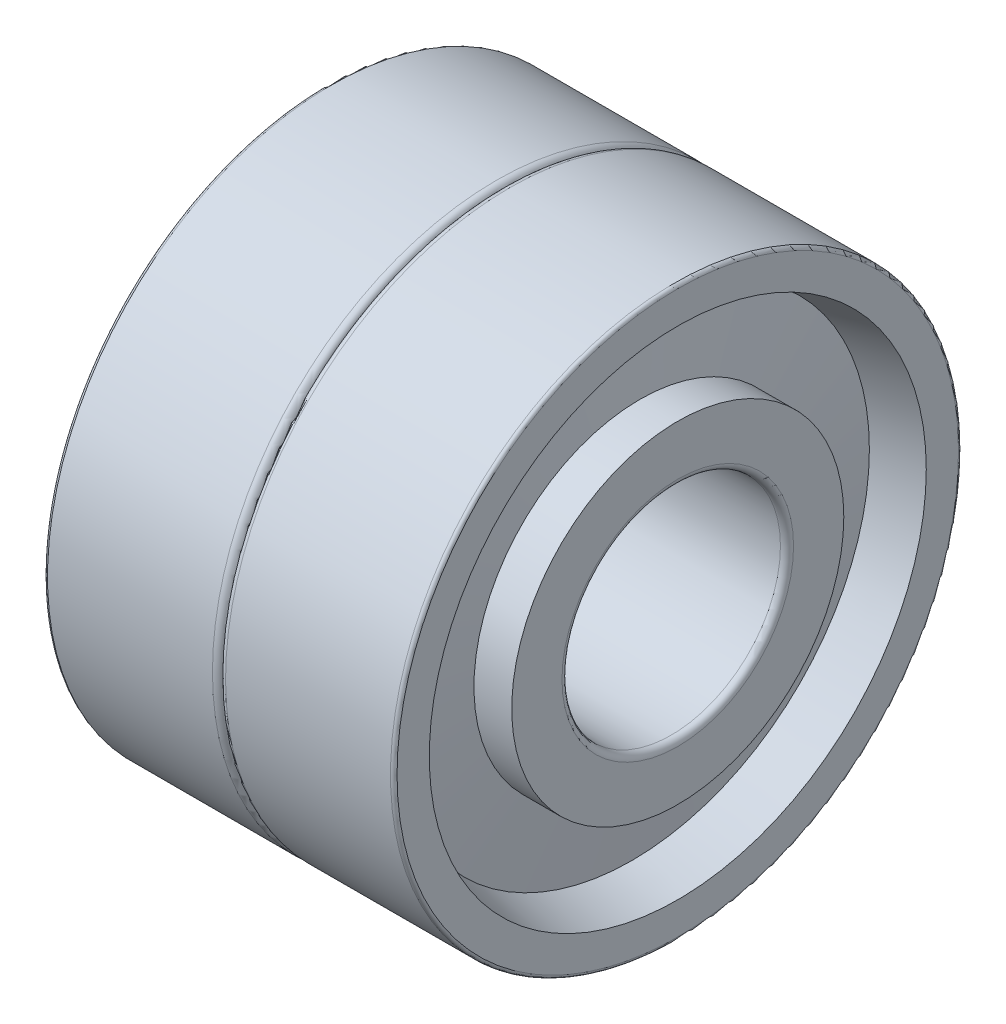
ISO-10303-21;
HEADER;
FILE_DESCRIPTION(('STEP AP214'),'2;1');
FILE_NAME('part.step','',(''),(''),'','','');
FILE_SCHEMA(('AUTOMOTIVE_DESIGN { 1 0 10303 214 1 1 1 1 }'));
ENDSEC;
DATA;
#1=APPLICATION_CONTEXT('core data for automotive mechanical design processes');
#2=APPLICATION_PROTOCOL_DEFINITION('international standard','automotive_design',2000,#1);
#3=PRODUCT_CONTEXT('',#1,'mechanical');
#4=PRODUCT('Part','Part','',(#3));
#5=PRODUCT_RELATED_PRODUCT_CATEGORY('part','',(#4));
#6=PRODUCT_DEFINITION_FORMATION('','',#4);
#7=PRODUCT_DEFINITION_CONTEXT('part definition',#1,'design');
#8=PRODUCT_DEFINITION('design','',#6,#7);
#9=PRODUCT_DEFINITION_SHAPE('','',#8);
#10=(LENGTH_UNIT() NAMED_UNIT(*) SI_UNIT(.MILLI.,.METRE.));
#11=(NAMED_UNIT(*) PLANE_ANGLE_UNIT() SI_UNIT($,.RADIAN.));
#12=(NAMED_UNIT(*) SI_UNIT($,.STERADIAN.) SOLID_ANGLE_UNIT());
#13=UNCERTAINTY_MEASURE_WITH_UNIT(LENGTH_MEASURE(1.E-05),#10,'distance_accuracy_value','');
#14=(GEOMETRIC_REPRESENTATION_CONTEXT(3) GLOBAL_UNCERTAINTY_ASSIGNED_CONTEXT((#13)) GLOBAL_UNIT_ASSIGNED_CONTEXT((#10,
#11,#12)) REPRESENTATION_CONTEXT('',''));
#15=CARTESIAN_POINT('',(0.,0.,0.));
#16=DIRECTION('',(0.,0.,1.));
#17=DIRECTION('',(1.,0.,0.));
#18=AXIS2_PLACEMENT_3D('',#15,#16,#17);
#19=CARTESIAN_POINT('',(3.925,0.,0.));
#20=DIRECTION('',(1.,0.,0.));
#21=DIRECTION('',(0.,0.,-1.));
#22=AXIS2_PLACEMENT_3D('',#19,#20,#21);
#23=CYLINDRICAL_SURFACE('',#22,5.);
#24=CARTESIAN_POINT('',(0.15,0.,0.));
#25=DIRECTION('',(-1.,0.,0.));
#26=DIRECTION('',(0.,0.,1.));
#27=AXIS2_PLACEMENT_3D('',#24,#25,#26);
#28=CIRCLE('',#27,5.);
#29=CARTESIAN_POINT('',(0.15,0.,5.));
#30=VERTEX_POINT('',#29);
#31=EDGE_CURVE('E147',#30,#30,#28,.F.);
#32=ORIENTED_EDGE('',*,*,#31,.F.);
#33=EDGE_LOOP('',(#32));
#34=FACE_BOUND('',#33,.T.);
#35=CARTESIAN_POINT('',(7.7,0.,0.));
#36=DIRECTION('',(-1.,0.,0.));
#37=DIRECTION('',(0.,0.,1.));
#38=AXIS2_PLACEMENT_3D('',#35,#36,#37);
#39=CIRCLE('',#38,5.);
#40=CARTESIAN_POINT('',(7.7,0.,5.));
#41=VERTEX_POINT('',#40);
#42=EDGE_CURVE('E142',#41,#41,#39,.T.);
#43=ORIENTED_EDGE('',*,*,#42,.F.);
#44=EDGE_LOOP('',(#43));
#45=FACE_BOUND('',#44,.T.);
#46=ADVANCED_FACE('F17',(#34,#45),#23,.F.);
#47=CARTESIAN_POINT('',(0.150000000000001,0.,0.));
#48=DIRECTION('',(-1.,0.,0.));
#49=DIRECTION('',(0.,0.,1.));
#50=AXIS2_PLACEMENT_3D('',#47,#48,#49);
#51=TOROIDAL_SURFACE('',#50,5.15,0.150000000000001);
#52=ORIENTED_EDGE('',*,*,#31,.T.);
#53=EDGE_LOOP('',(#52));
#54=FACE_BOUND('',#53,.T.);
#55=CARTESIAN_POINT('',(0.,0.,0.));
#56=DIRECTION('',(-1.,0.,0.));
#57=DIRECTION('',(0.,0.,1.));
#58=AXIS2_PLACEMENT_3D('',#55,#56,#57);
#59=CIRCLE('',#58,5.15);
#60=CARTESIAN_POINT('',(0.,0.,5.15));
#61=VERTEX_POINT('',#60);
#62=EDGE_CURVE('E135',#61,#61,#59,.F.);
#63=ORIENTED_EDGE('',*,*,#62,.F.);
#64=EDGE_LOOP('',(#63));
#65=FACE_BOUND('',#64,.T.);
#66=ADVANCED_FACE('F124',(#54,#65),#51,.T.);
#67=CARTESIAN_POINT('',(7.7,0.,0.));
#68=DIRECTION('',(-1.,0.,0.));
#69=DIRECTION('',(0.,0.,1.));
#70=AXIS2_PLACEMENT_3D('',#67,#68,#69);
#71=TOROIDAL_SURFACE('',#70,5.3,0.299999999999998);
#72=ORIENTED_EDGE('',*,*,#42,.T.);
#73=EDGE_LOOP('',(#72));
#74=FACE_BOUND('',#73,.T.);
#75=CARTESIAN_POINT('',(8.,0.,0.));
#76=DIRECTION('',(1.,0.,0.));
#77=DIRECTION('',(0.,0.,-1.));
#78=AXIS2_PLACEMENT_3D('',#75,#76,#77);
#79=CIRCLE('',#78,5.3);
#80=CARTESIAN_POINT('',(8.,5.3,0.));
#81=VERTEX_POINT('',#80);
#82=CARTESIAN_POINT('',(8.,0.,-5.3));
#83=VERTEX_POINT('',#82);
#84=EDGE_CURVE('E76',#81,#83,#79,.F.);
#85=ORIENTED_EDGE('',*,*,#84,.F.);
#86=CARTESIAN_POINT('',(8.,0.,0.));
#87=DIRECTION('',(1.,0.,0.));
#88=DIRECTION('',(0.,1.,0.));
#89=AXIS2_PLACEMENT_3D('',#86,#87,#88);
#90=CIRCLE('',#89,5.3);
#91=CARTESIAN_POINT('',(8.,0.,5.3));
#92=VERTEX_POINT('',#91);
#93=EDGE_CURVE('E73',#92,#81,#90,.F.);
#94=ORIENTED_EDGE('',*,*,#93,.F.);
#95=CARTESIAN_POINT('',(8.,0.,0.));
#96=DIRECTION('',(1.,0.,0.));
#97=DIRECTION('',(0.,0.,1.));
#98=AXIS2_PLACEMENT_3D('',#95,#96,#97);
#99=CIRCLE('',#98,5.3);
#100=EDGE_CURVE('E70',#83,#92,#99,.F.);
#101=ORIENTED_EDGE('',*,*,#100,.F.);
#102=EDGE_LOOP('',(#85,#94,#101));
#103=FACE_BOUND('',#102,.T.);
#104=ADVANCED_FACE('F75',(#74,#103),#71,.T.);
#105=CARTESIAN_POINT('',(-0.150000000000003,0.,0.));
#106=DIRECTION('',(-1.,0.,0.));
#107=DIRECTION('',(0.,0.,1.));
#108=AXIS2_PLACEMENT_3D('',#105,#106,#107);
#109=TOROIDAL_SURFACE('',#108,5.15,0.150000000000003);
#110=ORIENTED_EDGE('',*,*,#62,.T.);
#111=EDGE_LOOP('',(#110));
#112=FACE_BOUND('',#111,.T.);
#113=CARTESIAN_POINT('',(-0.15,0.,0.));
#114=DIRECTION('',(1.,0.,0.));
#115=DIRECTION('',(0.,0.,-1.));
#116=AXIS2_PLACEMENT_3D('',#113,#114,#115);
#117=CIRCLE('',#116,5.);
#118=CARTESIAN_POINT('',(-0.15,0.,-5.));
#119=VERTEX_POINT('',#118);
#120=EDGE_CURVE('E80',#119,#119,#117,.F.);
#121=ORIENTED_EDGE('',*,*,#120,.T.);
#122=EDGE_LOOP('',(#121));
#123=FACE_BOUND('',#122,.T.);
#124=ADVANCED_FACE('F105',(#112,#123),#109,.T.);
#125=CARTESIAN_POINT('',(8.,6.45,0.));
#126=DIRECTION('',(1.,0.,0.));
#127=DIRECTION('',(0.,0.,-1.));
#128=AXIS2_PLACEMENT_3D('',#125,#126,#127);
#129=PLANE('',#128);
#130=ORIENTED_EDGE('',*,*,#100,.T.);
#131=ORIENTED_EDGE('',*,*,#93,.T.);
#132=ORIENTED_EDGE('',*,*,#84,.T.);
#133=EDGE_LOOP('',(#130,#131,#132));
#134=FACE_BOUND('',#133,.T.);
#135=CARTESIAN_POINT('',(8.,0.,0.));
#136=DIRECTION('',(1.,0.,0.));
#137=DIRECTION('',(0.,0.,-1.));
#138=AXIS2_PLACEMENT_3D('',#135,#136,#137);
#139=CIRCLE('',#138,7.6);
#140=CARTESIAN_POINT('',(8.,0.,-7.6));
#141=VERTEX_POINT('',#140);
#142=EDGE_CURVE('E119',#141,#141,#139,.F.);
#143=ORIENTED_EDGE('',*,*,#142,.F.);
#144=EDGE_LOOP('',(#143));
#145=FACE_BOUND('',#144,.T.);
#146=ADVANCED_FACE('F84',(#134,#145),#129,.T.);
#147=CARTESIAN_POINT('',(-3.925,0.,0.));
#148=DIRECTION('',(1.,0.,0.));
#149=DIRECTION('',(0.,0.,-1.));
#150=AXIS2_PLACEMENT_3D('',#147,#148,#149);
#151=CYLINDRICAL_SURFACE('',#150,5.);
#152=CARTESIAN_POINT('',(-7.7,0.,0.));
#153=DIRECTION('',(-1.,0.,0.));
#154=DIRECTION('',(0.,0.,1.));
#155=AXIS2_PLACEMENT_3D('',#152,#153,#154);
#156=CIRCLE('',#155,5.);
#157=CARTESIAN_POINT('',(-7.7,0.,5.));
#158=VERTEX_POINT('',#157);
#159=EDGE_CURVE('E166',#158,#158,#156,.F.);
#160=ORIENTED_EDGE('',*,*,#159,.F.);
#161=EDGE_LOOP('',(#160));
#162=FACE_BOUND('',#161,.T.);
#163=ORIENTED_EDGE('',*,*,#120,.F.);
#164=EDGE_LOOP('',(#163));
#165=FACE_BOUND('',#164,.T.);
#166=ADVANCED_FACE('F104',(#162,#165),#151,.F.);
#167=CARTESIAN_POINT('',(7.13480296870328,0.,0.));
#168=DIRECTION('',(1.,0.,0.));
#169=DIRECTION('',(0.,0.,-1.));
#170=AXIS2_PLACEMENT_3D('',#167,#168,#169);
#171=CYLINDRICAL_SURFACE('',#170,7.6);
#172=CARTESIAN_POINT('',(6.26960593740656,0.,0.));
#173=DIRECTION('',(-1.,0.,0.));
#174=DIRECTION('',(0.,1.,0.));
#175=AXIS2_PLACEMENT_3D('',#172,#173,#174);
#176=CIRCLE('',#175,7.6);
#177=CARTESIAN_POINT('',(6.26960593740656,7.6,0.));
#178=VERTEX_POINT('',#177);
#179=EDGE_CURVE('E325',#178,#178,#176,.T.);
#180=ORIENTED_EDGE('',*,*,#179,.F.);
#181=EDGE_LOOP('',(#180));
#182=FACE_BOUND('',#181,.T.);
#183=ORIENTED_EDGE('',*,*,#142,.T.);
#184=EDGE_LOOP('',(#183));
#185=FACE_BOUND('',#184,.T.);
#186=ADVANCED_FACE('F310',(#182,#185),#171,.T.);
#187=CARTESIAN_POINT('',(-7.7,0.,0.));
#188=DIRECTION('',(-1.,0.,0.));
#189=DIRECTION('',(0.,0.,1.));
#190=AXIS2_PLACEMENT_3D('',#187,#188,#189);
#191=TOROIDAL_SURFACE('',#190,5.29999999999999,0.299999999999995);
#192=ORIENTED_EDGE('',*,*,#159,.T.);
#193=EDGE_LOOP('',(#192));
#194=FACE_BOUND('',#193,.T.);
#195=CARTESIAN_POINT('',(-7.99999999999999,0.,0.));
#196=DIRECTION('',(-1.,0.,0.));
#197=DIRECTION('',(0.,0.,-1.));
#198=AXIS2_PLACEMENT_3D('',#195,#196,#197);
#199=CIRCLE('',#198,5.3);
#200=CARTESIAN_POINT('',(-8.,0.,5.3));
#201=VERTEX_POINT('',#200);
#202=CARTESIAN_POINT('',(-8.,0.,-5.3));
#203=VERTEX_POINT('',#202);
#204=EDGE_CURVE('E321',#201,#203,#199,.F.);
#205=ORIENTED_EDGE('',*,*,#204,.F.);
#206=CARTESIAN_POINT('',(-7.99999999999999,0.,0.));
#207=DIRECTION('',(-1.,0.,0.));
#208=DIRECTION('',(0.,0.,1.));
#209=AXIS2_PLACEMENT_3D('',#206,#207,#208);
#210=CIRCLE('',#209,5.3);
#211=CARTESIAN_POINT('',(-8.,5.3,0.));
#212=VERTEX_POINT('',#211);
#213=EDGE_CURVE('E292',#212,#201,#210,.F.);
#214=ORIENTED_EDGE('',*,*,#213,.F.);
#215=CARTESIAN_POINT('',(-7.99999999999999,0.,0.));
#216=DIRECTION('',(-1.,0.,0.));
#217=DIRECTION('',(0.,1.,0.));
#218=AXIS2_PLACEMENT_3D('',#215,#216,#217);
#219=CIRCLE('',#218,5.3);
#220=EDGE_CURVE('E333',#203,#212,#219,.F.);
#221=ORIENTED_EDGE('',*,*,#220,.F.);
#222=EDGE_LOOP('',(#205,#214,#221));
#223=FACE_BOUND('',#222,.T.);
#224=ADVANCED_FACE('F299',(#194,#223),#191,.T.);
#225=CARTESIAN_POINT('',(5.90633646485784,0.,0.));
#226=DIRECTION('',(-1.,0.,0.));
#227=DIRECTION('',(0.,0.,1.));
#228=AXIS2_PLACEMENT_3D('',#225,#226,#227);
#229=CONICAL_SURFACE('',#228,10.8646695133091,1.45997922354304);
#230=CARTESIAN_POINT('',(5.90633646485784,0.,0.));
#231=DIRECTION('',(1.,0.,0.));
#232=DIRECTION('',(0.,1.,0.));
#233=AXIS2_PLACEMENT_3D('',#230,#231,#232);
#234=CIRCLE('',#233,10.8646695133091);
#235=CARTESIAN_POINT('',(5.90633646485784,10.8646695133091,0.));
#236=VERTEX_POINT('',#235);
#237=EDGE_CURVE('E163',#236,#236,#234,.T.);
#238=ORIENTED_EDGE('',*,*,#237,.T.);
#239=EDGE_LOOP('',(#238));
#240=FACE_BOUND('',#239,.T.);
#241=ORIENTED_EDGE('',*,*,#179,.T.);
#242=EDGE_LOOP('',(#241));
#243=FACE_BOUND('',#242,.T.);
#244=ADVANCED_FACE('F309',(#240,#243),#229,.T.);
#245=CARTESIAN_POINT('',(-8.,6.45,0.));
#246=DIRECTION('',(-1.,0.,0.));
#247=DIRECTION('',(0.,0.,1.));
#248=AXIS2_PLACEMENT_3D('',#245,#246,#247);
#249=PLANE('',#248);
#250=CARTESIAN_POINT('',(-8.,0.,0.));
#251=DIRECTION('',(1.,0.,0.));
#252=DIRECTION('',(0.,0.,-1.));
#253=AXIS2_PLACEMENT_3D('',#250,#251,#252);
#254=CIRCLE('',#253,7.6);
#255=CARTESIAN_POINT('',(-8.,0.,-7.6));
#256=VERTEX_POINT('',#255);
#257=EDGE_CURVE('E160',#256,#256,#254,.T.);
#258=ORIENTED_EDGE('',*,*,#257,.F.);
#259=EDGE_LOOP('',(#258));
#260=FACE_BOUND('',#259,.T.);
#261=ORIENTED_EDGE('',*,*,#213,.T.);
#262=ORIENTED_EDGE('',*,*,#204,.T.);
#263=ORIENTED_EDGE('',*,*,#220,.T.);
#264=EDGE_LOOP('',(#261,#262,#263));
#265=FACE_BOUND('',#264,.T.);
#266=ADVANCED_FACE('F511',(#260,#265),#249,.T.);
#267=CARTESIAN_POINT('',(7.99999999999999,0.,0.));
#268=DIRECTION('',(1.,0.,0.));
#269=DIRECTION('',(0.,0.,-1.));
#270=AXIS2_PLACEMENT_3D('',#267,#268,#269);
#271=CONICAL_SURFACE('',#270,11.375,0.239087715072567);
#272=CARTESIAN_POINT('',(7.99999999999999,0.,0.));
#273=DIRECTION('',(1.,0.,0.));
#274=DIRECTION('',(0.,0.,-1.));
#275=AXIS2_PLACEMENT_3D('',#272,#273,#274);
#276=CIRCLE('',#275,11.375);
#277=CARTESIAN_POINT('',(7.99999999999999,0.,-11.375));
#278=VERTEX_POINT('',#277);
#279=EDGE_CURVE('E156',#278,#278,#276,.F.);
#280=ORIENTED_EDGE('',*,*,#279,.F.);
#281=EDGE_LOOP('',(#280));
#282=FACE_BOUND('',#281,.T.);
#283=ORIENTED_EDGE('',*,*,#237,.F.);
#284=EDGE_LOOP('',(#283));
#285=FACE_BOUND('',#284,.T.);
#286=ADVANCED_FACE('F501',(#282,#285),#271,.F.);
#287=CARTESIAN_POINT('',(-7.13480296870328,0.,0.));
#288=DIRECTION('',(1.,0.,0.));
#289=DIRECTION('',(0.,0.,-1.));
#290=AXIS2_PLACEMENT_3D('',#287,#288,#289);
#291=CYLINDRICAL_SURFACE('',#290,7.6);
#292=ORIENTED_EDGE('',*,*,#257,.T.);
#293=EDGE_LOOP('',(#292));
#294=FACE_BOUND('',#293,.T.);
#295=CARTESIAN_POINT('',(-6.26960593740656,0.,0.));
#296=DIRECTION('',(1.,0.,0.));
#297=DIRECTION('',(0.,1.,0.));
#298=AXIS2_PLACEMENT_3D('',#295,#296,#297);
#299=CIRCLE('',#298,7.6);
#300=CARTESIAN_POINT('',(-6.26960593740656,7.6,0.));
#301=VERTEX_POINT('',#300);
#302=EDGE_CURVE('E159',#301,#301,#299,.T.);
#303=ORIENTED_EDGE('',*,*,#302,.F.);
#304=EDGE_LOOP('',(#303));
#305=FACE_BOUND('',#304,.T.);
#306=ADVANCED_FACE('F492',(#294,#305),#291,.T.);
#307=CARTESIAN_POINT('',(8.,12.1125,0.));
#308=DIRECTION('',(1.,0.,0.));
#309=DIRECTION('',(0.,0.,-1.));
#310=AXIS2_PLACEMENT_3D('',#307,#308,#309);
#311=PLANE('',#310);
#312=ORIENTED_EDGE('',*,*,#279,.T.);
#313=EDGE_LOOP('',(#312));
#314=FACE_BOUND('',#313,.T.);
#315=CARTESIAN_POINT('',(8.,0.,0.));
#316=DIRECTION('',(-1.,0.,0.));
#317=DIRECTION('',(0.,0.,1.));
#318=AXIS2_PLACEMENT_3D('',#315,#316,#317);
#319=CIRCLE('',#318,12.85);
#320=CARTESIAN_POINT('',(8.,0.,12.85));
#321=VERTEX_POINT('',#320);
#322=CARTESIAN_POINT('',(8.,12.85,0.));
#323=VERTEX_POINT('',#322);
#324=EDGE_CURVE('E655',#321,#323,#319,.T.);
#325=ORIENTED_EDGE('',*,*,#324,.F.);
#326=CARTESIAN_POINT('',(8.,0.,0.));
#327=DIRECTION('',(-1.,0.,0.));
#328=DIRECTION('',(0.,0.,-1.));
#329=AXIS2_PLACEMENT_3D('',#326,#327,#328);
#330=CIRCLE('',#329,12.85);
#331=CARTESIAN_POINT('',(8.,0.,-12.85));
#332=VERTEX_POINT('',#331);
#333=EDGE_CURVE('E647',#332,#321,#330,.T.);
#334=ORIENTED_EDGE('',*,*,#333,.F.);
#335=CARTESIAN_POINT('',(8.,0.,0.));
#336=DIRECTION('',(-1.,0.,0.));
#337=DIRECTION('',(0.,1.,0.));
#338=AXIS2_PLACEMENT_3D('',#335,#336,#337);
#339=CIRCLE('',#338,12.85);
#340=EDGE_CURVE('E279',#323,#332,#339,.T.);
#341=ORIENTED_EDGE('',*,*,#340,.F.);
#342=EDGE_LOOP('',(#325,#334,#341));
#343=FACE_BOUND('',#342,.T.);
#344=ADVANCED_FACE('F483',(#314,#343),#311,.T.);
#345=CARTESIAN_POINT('',(-5.90633646485784,0.,0.));
#346=DIRECTION('',(1.,0.,0.));
#347=DIRECTION('',(0.,0.,-1.));
#348=AXIS2_PLACEMENT_3D('',#345,#346,#347);
#349=CONICAL_SURFACE('',#348,10.8646695133091,1.45997922354304);
#350=ORIENTED_EDGE('',*,*,#302,.T.);
#351=EDGE_LOOP('',(#350));
#352=FACE_BOUND('',#351,.T.);
#353=CARTESIAN_POINT('',(-5.90633646485784,0.,0.));
#354=DIRECTION('',(-1.,0.,0.));
#355=DIRECTION('',(0.,1.,0.));
#356=AXIS2_PLACEMENT_3D('',#353,#354,#355);
#357=CIRCLE('',#356,10.8646695133091);
#358=CARTESIAN_POINT('',(-5.90633646485784,10.8646695133091,0.));
#359=VERTEX_POINT('',#358);
#360=EDGE_CURVE('E247',#359,#359,#357,.T.);
#361=ORIENTED_EDGE('',*,*,#360,.T.);
#362=EDGE_LOOP('',(#361));
#363=FACE_BOUND('',#362,.T.);
#364=ADVANCED_FACE('F255',(#352,#363),#349,.T.);
#365=CARTESIAN_POINT('',(7.85,0.,0.));
#366=DIRECTION('',(-1.,0.,0.));
#367=DIRECTION('',(0.,0.,1.));
#368=AXIS2_PLACEMENT_3D('',#365,#366,#367);
#369=TOROIDAL_SURFACE('',#368,12.85,0.15);
#370=CARTESIAN_POINT('',(7.85,0.,0.));
#371=DIRECTION('',(1.,0.,0.));
#372=DIRECTION('',(0.,0.,-1.));
#373=AXIS2_PLACEMENT_3D('',#370,#371,#372);
#374=CIRCLE('',#373,13.);
#375=CARTESIAN_POINT('',(7.85,0.,-13.));
#376=VERTEX_POINT('',#375);
#377=EDGE_CURVE('E155',#376,#376,#374,.F.);
#378=ORIENTED_EDGE('',*,*,#377,.F.);
#379=EDGE_LOOP('',(#378));
#380=FACE_BOUND('',#379,.T.);
#381=ORIENTED_EDGE('',*,*,#333,.T.);
#382=ORIENTED_EDGE('',*,*,#324,.T.);
#383=ORIENTED_EDGE('',*,*,#340,.T.);
#384=EDGE_LOOP('',(#381,#382,#383));
#385=FACE_BOUND('',#384,.T.);
#386=ADVANCED_FACE('F250',(#380,#385),#369,.T.);
#387=CARTESIAN_POINT('',(-7.99999999999999,0.,0.));
#388=DIRECTION('',(-1.,0.,0.));
#389=DIRECTION('',(0.,0.,1.));
#390=AXIS2_PLACEMENT_3D('',#387,#388,#389);
#391=CONICAL_SURFACE('',#390,11.375,0.239087715072567);
#392=ORIENTED_EDGE('',*,*,#360,.F.);
#393=EDGE_LOOP('',(#392));
#394=FACE_BOUND('',#393,.T.);
#395=CARTESIAN_POINT('',(-7.99999999999999,0.,0.));
#396=DIRECTION('',(-1.,0.,0.));
#397=DIRECTION('',(0.,0.,1.));
#398=AXIS2_PLACEMENT_3D('',#395,#396,#397);
#399=CIRCLE('',#398,11.375);
#400=CARTESIAN_POINT('',(-7.99999999999999,0.,11.375));
#401=VERTEX_POINT('',#400);
#402=EDGE_CURVE('E151',#401,#401,#399,.F.);
#403=ORIENTED_EDGE('',*,*,#402,.F.);
#404=EDGE_LOOP('',(#403));
#405=FACE_BOUND('',#404,.T.);
#406=ADVANCED_FACE('F254',(#394,#405),#391,.F.);
#407=CARTESIAN_POINT('',(4.075,0.,0.));
#408=DIRECTION('',(1.,0.,0.));
#409=DIRECTION('',(0.,0.,-1.));
#410=AXIS2_PLACEMENT_3D('',#407,#408,#409);
#411=CYLINDRICAL_SURFACE('',#410,13.);
#412=ORIENTED_EDGE('',*,*,#377,.T.);
#413=EDGE_LOOP('',(#412));
#414=FACE_BOUND('',#413,.T.);
#415=CARTESIAN_POINT('',(0.300000000000001,0.,0.));
#416=DIRECTION('',(-1.,0.,0.));
#417=DIRECTION('',(0.,0.,1.));
#418=AXIS2_PLACEMENT_3D('',#415,#416,#417);
#419=CIRCLE('',#418,13.);
#420=CARTESIAN_POINT('',(0.300000000000001,0.,13.));
#421=VERTEX_POINT('',#420);
#422=EDGE_CURVE('E154',#421,#421,#419,.T.);
#423=ORIENTED_EDGE('',*,*,#422,.F.);
#424=EDGE_LOOP('',(#423));
#425=FACE_BOUND('',#424,.T.);
#426=ADVANCED_FACE('F214',(#414,#425),#411,.T.);
#427=CARTESIAN_POINT('',(-8.,12.1125,0.));
#428=DIRECTION('',(-1.,0.,0.));
#429=DIRECTION('',(0.,0.,1.));
#430=AXIS2_PLACEMENT_3D('',#427,#428,#429);
#431=PLANE('',#430);
#432=CARTESIAN_POINT('',(-8.,0.,0.));
#433=DIRECTION('',(1.,0.,0.));
#434=DIRECTION('',(0.,0.,1.));
#435=AXIS2_PLACEMENT_3D('',#432,#433,#434);
#436=CIRCLE('',#435,12.85);
#437=CARTESIAN_POINT('',(-8.,0.,12.85));
#438=VERTEX_POINT('',#437);
#439=CARTESIAN_POINT('',(-8.,0.,-12.85));
#440=VERTEX_POINT('',#439);
#441=EDGE_CURVE('E232',#438,#440,#436,.T.);
#442=ORIENTED_EDGE('',*,*,#441,.F.);
#443=CARTESIAN_POINT('',(-8.,0.,0.));
#444=DIRECTION('',(1.,0.,0.));
#445=DIRECTION('',(0.,1.,0.));
#446=AXIS2_PLACEMENT_3D('',#443,#444,#445);
#447=CIRCLE('',#446,12.85);
#448=CARTESIAN_POINT('',(-8.,12.85,0.));
#449=VERTEX_POINT('',#448);
#450=EDGE_CURVE('E230',#449,#438,#447,.T.);
#451=ORIENTED_EDGE('',*,*,#450,.F.);
#452=CARTESIAN_POINT('',(-8.,0.,0.));
#453=DIRECTION('',(1.,0.,0.));
#454=DIRECTION('',(0.,0.,-1.));
#455=AXIS2_PLACEMENT_3D('',#452,#453,#454);
#456=CIRCLE('',#455,12.85);
#457=EDGE_CURVE('E37',#440,#449,#456,.T.);
#458=ORIENTED_EDGE('',*,*,#457,.F.);
#459=EDGE_LOOP('',(#442,#451,#458));
#460=FACE_BOUND('',#459,.T.);
#461=ORIENTED_EDGE('',*,*,#402,.T.);
#462=EDGE_LOOP('',(#461));
#463=FACE_BOUND('',#462,.T.);
#464=ADVANCED_FACE('F205',(#460,#463),#431,.T.);
#465=CARTESIAN_POINT('',(0.300000000000001,0.,0.));
#466=DIRECTION('',(-1.,0.,0.));
#467=DIRECTION('',(0.,0.,1.));
#468=AXIS2_PLACEMENT_3D('',#465,#466,#467);
#469=TOROIDAL_SURFACE('',#468,12.7,0.300000000000002);
#470=ORIENTED_EDGE('',*,*,#422,.T.);
#471=EDGE_LOOP('',(#470));
#472=FACE_BOUND('',#471,.T.);
#473=CARTESIAN_POINT('',(0.,0.,0.));
#474=DIRECTION('',(-1.,0.,0.));
#475=DIRECTION('',(0.,0.,1.));
#476=AXIS2_PLACEMENT_3D('',#473,#474,#475);
#477=CIRCLE('',#476,12.6999999747339);
#478=CARTESIAN_POINT('',(0.,0.,12.6999999747339));
#479=VERTEX_POINT('',#478);
#480=EDGE_CURVE('E196',#479,#479,#477,.T.);
#481=ORIENTED_EDGE('',*,*,#480,.F.);
#482=EDGE_LOOP('',(#481));
#483=FACE_BOUND('',#482,.T.);
#484=ADVANCED_FACE('F186',(#472,#483),#469,.T.);
#485=CARTESIAN_POINT('',(-7.85,0.,0.));
#486=DIRECTION('',(-1.,0.,0.));
#487=DIRECTION('',(0.,0.,1.));
#488=AXIS2_PLACEMENT_3D('',#485,#486,#487);
#489=TOROIDAL_SURFACE('',#488,12.85,0.15);
#490=ORIENTED_EDGE('',*,*,#450,.T.);
#491=ORIENTED_EDGE('',*,*,#441,.T.);
#492=ORIENTED_EDGE('',*,*,#457,.T.);
#493=EDGE_LOOP('',(#490,#491,#492));
#494=FACE_BOUND('',#493,.T.);
#495=CARTESIAN_POINT('',(-7.85,0.,0.));
#496=DIRECTION('',(1.,0.,0.));
#497=DIRECTION('',(0.,0.,-1.));
#498=AXIS2_PLACEMENT_3D('',#495,#496,#497);
#499=CIRCLE('',#498,13.);
#500=CARTESIAN_POINT('',(-7.85,0.,-13.));
#501=VERTEX_POINT('',#500);
#502=EDGE_CURVE('E28',#501,#501,#499,.T.);
#503=ORIENTED_EDGE('',*,*,#502,.F.);
#504=EDGE_LOOP('',(#503));
#505=FACE_BOUND('',#504,.T.);
#506=ADVANCED_FACE('F174',(#494,#505),#489,.T.);
#507=CARTESIAN_POINT('',(-0.300000000000001,0.,0.));
#508=DIRECTION('',(-1.,0.,0.));
#509=DIRECTION('',(0.,0.,1.));
#510=AXIS2_PLACEMENT_3D('',#507,#508,#509);
#511=TOROIDAL_SURFACE('',#510,12.7,0.300000000000002);
#512=ORIENTED_EDGE('',*,*,#480,.T.);
#513=EDGE_LOOP('',(#512));
#514=FACE_BOUND('',#513,.T.);
#515=CARTESIAN_POINT('',(-0.299999999999999,0.,0.));
#516=DIRECTION('',(1.,0.,0.));
#517=DIRECTION('',(0.,0.,-1.));
#518=AXIS2_PLACEMENT_3D('',#515,#516,#517);
#519=CIRCLE('',#518,13.);
#520=CARTESIAN_POINT('',(-0.299999999999999,0.,-13.));
#521=VERTEX_POINT('',#520);
#522=EDGE_CURVE('E11',#521,#521,#519,.F.);
#523=ORIENTED_EDGE('',*,*,#522,.F.);
#524=EDGE_LOOP('',(#523));
#525=FACE_BOUND('',#524,.T.);
#526=ADVANCED_FACE('F185',(#514,#525),#511,.T.);
#527=CARTESIAN_POINT('',(-4.075,0.,0.));
#528=DIRECTION('',(1.,0.,0.));
#529=DIRECTION('',(0.,0.,-1.));
#530=AXIS2_PLACEMENT_3D('',#527,#528,#529);
#531=CYLINDRICAL_SURFACE('',#530,13.);
#532=ORIENTED_EDGE('',*,*,#502,.T.);
#533=EDGE_LOOP('',(#532));
#534=FACE_BOUND('',#533,.T.);
#535=ORIENTED_EDGE('',*,*,#522,.T.);
#536=EDGE_LOOP('',(#535));
#537=FACE_BOUND('',#536,.T.);
#538=ADVANCED_FACE('F346',(#534,#537),#531,.T.);
#539=CLOSED_SHELL('',(#46,#66,#104,#124,#146,#166,#186,#224,#244,#266,#286,#306,#344,#364,#386,
#406,#426,#464,#484,#506,#526,#538));
#540=CARTESIAN_POINT('',(2.09366353504947,0.,0.));
#541=DIRECTION('',(1.,0.,0.));
#542=DIRECTION('',(0.,0.,-1.));
#543=AXIS2_PLACEMENT_3D('',#540,#541,#542);
#544=CONICAL_SURFACE('',#543,7.13533048666193,0.239087715070004);
#545=CARTESIAN_POINT('',(-5.6843418860808E-11,0.,0.));
#546=DIRECTION('',(-1.,0.,0.));
#547=DIRECTION('',(0.,1.,0.));
#548=AXIS2_PLACEMENT_3D('',#545,#546,#547);
#549=CIRCLE('',#548,6.62500000001387);
#550=CARTESIAN_POINT('',(-5.6843418860808E-11,6.62500000001387,0.));
#551=VERTEX_POINT('',#550);
#552=EDGE_CURVE('E391',#551,#551,#549,.T.);
#553=ORIENTED_EDGE('',*,*,#552,.F.);
#554=EDGE_LOOP('',(#553));
#555=FACE_BOUND('',#554,.T.);
#556=CARTESIAN_POINT('',(2.09366353514216,0.,0.));
#557=DIRECTION('',(-1.,0.,0.));
#558=DIRECTION('',(0.,1.,0.));
#559=AXIS2_PLACEMENT_3D('',#556,#557,#558);
#560=CIRCLE('',#559,7.1353304866909);
#561=CARTESIAN_POINT('',(2.09366353514216,7.1353304866909,0.));
#562=VERTEX_POINT('',#561);
#563=EDGE_CURVE('E388',#562,#562,#560,.T.);
#564=ORIENTED_EDGE('',*,*,#563,.T.);
#565=EDGE_LOOP('',(#564));
#566=FACE_BOUND('',#565,.T.);
#567=ADVANCED_FACE('F354',(#555,#566),#544,.T.);
#568=CARTESIAN_POINT('',(-2.09366353504947,0.,0.));
#569=DIRECTION('',(-1.,0.,0.));
#570=DIRECTION('',(0.,0.,1.));
#571=AXIS2_PLACEMENT_3D('',#568,#569,#570);
#572=CONICAL_SURFACE('',#571,7.13533048666193,0.239087715070004);
#573=CARTESIAN_POINT('',(-2.09366353514216,0.,0.));
#574=DIRECTION('',(1.,0.,0.));
#575=DIRECTION('',(0.,1.,0.));
#576=AXIS2_PLACEMENT_3D('',#573,#574,#575);
#577=CIRCLE('',#576,7.1353304866909);
#578=CARTESIAN_POINT('',(-2.09366353514216,7.1353304866909,0.));
#579=VERTEX_POINT('',#578);
#580=EDGE_CURVE('E383',#579,#579,#577,.T.);
#581=ORIENTED_EDGE('',*,*,#580,.T.);
#582=EDGE_LOOP('',(#581));
#583=FACE_BOUND('',#582,.T.);
#584=ORIENTED_EDGE('',*,*,#552,.T.);
#585=EDGE_LOOP('',(#584));
#586=FACE_BOUND('',#585,.T.);
#587=ADVANCED_FACE('F356',(#583,#586),#572,.T.);
#588=CARTESIAN_POINT('',(1.73039406259344,0.,0.));
#589=DIRECTION('',(-1.,0.,0.));
#590=DIRECTION('',(0.,0.,1.));
#591=AXIS2_PLACEMENT_3D('',#588,#589,#590);
#592=CONICAL_SURFACE('',#591,10.4,1.45997922354304);
#593=ORIENTED_EDGE('',*,*,#563,.F.);
#594=EDGE_LOOP('',(#593));
#595=FACE_BOUND('',#594,.T.);
#596=CARTESIAN_POINT('',(1.73039406259344,0.,0.));
#597=DIRECTION('',(1.,0.,0.));
#598=DIRECTION('',(0.,0.,-1.));
#599=AXIS2_PLACEMENT_3D('',#596,#597,#598);
#600=CIRCLE('',#599,10.4);
#601=CARTESIAN_POINT('',(1.73039406259344,0.,-10.4));
#602=VERTEX_POINT('',#601);
#603=EDGE_CURVE('E379',#602,#602,#600,.F.);
#604=ORIENTED_EDGE('',*,*,#603,.T.);
#605=EDGE_LOOP('',(#604));
#606=FACE_BOUND('',#605,.T.);
#607=ADVANCED_FACE('F361',(#595,#606),#592,.F.);
#608=CARTESIAN_POINT('',(-1.73039406259344,0.,0.));
#609=DIRECTION('',(1.,0.,0.));
#610=DIRECTION('',(0.,0.,-1.));
#611=AXIS2_PLACEMENT_3D('',#608,#609,#610);
#612=CONICAL_SURFACE('',#611,10.4,1.45997922354304);
#613=CARTESIAN_POINT('',(-1.73039406259344,0.,0.));
#614=DIRECTION('',(1.,0.,0.));
#615=DIRECTION('',(0.,0.,-1.));
#616=AXIS2_PLACEMENT_3D('',#613,#614,#615);
#617=CIRCLE('',#616,10.4);
#618=CARTESIAN_POINT('',(-1.73039406259344,0.,-10.4));
#619=VERTEX_POINT('',#618);
#620=EDGE_CURVE('E150',#619,#619,#617,.T.);
#621=ORIENTED_EDGE('',*,*,#620,.T.);
#622=EDGE_LOOP('',(#621));
#623=FACE_BOUND('',#622,.T.);
#624=ORIENTED_EDGE('',*,*,#580,.F.);
#625=EDGE_LOOP('',(#624));
#626=FACE_BOUND('',#625,.T.);
#627=ADVANCED_FACE('F365',(#623,#626),#612,.F.);
#628=CARTESIAN_POINT('',(0.,0.,0.));
#629=DIRECTION('',(1.,0.,0.));
#630=DIRECTION('',(0.,0.,-1.));
#631=AXIS2_PLACEMENT_3D('',#628,#629,#630);
#632=CYLINDRICAL_SURFACE('',#631,10.4);
#633=ORIENTED_EDGE('',*,*,#603,.F.);
#634=EDGE_LOOP('',(#633));
#635=FACE_BOUND('',#634,.T.);
#636=ORIENTED_EDGE('',*,*,#620,.F.);
#637=EDGE_LOOP('',(#636));
#638=FACE_BOUND('',#637,.T.);
#639=ADVANCED_FACE('F369',(#635,#638),#632,.F.);
#640=CLOSED_SHELL('',(#567,#587,#607,#627,#639));
#641=ORIENTED_CLOSED_SHELL('',*,#640,.T.);
#642=BREP_WITH_VOIDS('B1',#539,(#641));
#643=ADVANCED_BREP_SHAPE_REPRESENTATION('',(#18,#642),#14);
#644=SHAPE_DEFINITION_REPRESENTATION(#9,#643);
ENDSEC;
END-ISO-10303-21;
